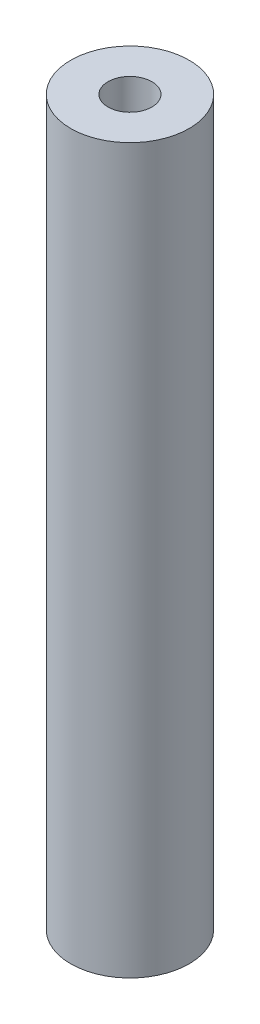
ISO-10303-21;
HEADER;
FILE_DESCRIPTION(('STEP AP214'),'2;1');
FILE_NAME('part.step','',(''),(''),'','','');
FILE_SCHEMA(('AUTOMOTIVE_DESIGN { 1 0 10303 214 1 1 1 1 }'));
ENDSEC;
DATA;
#1=APPLICATION_CONTEXT('core data for automotive mechanical design processes');
#2=APPLICATION_PROTOCOL_DEFINITION('international standard','automotive_design',2000,#1);
#3=PRODUCT_CONTEXT('',#1,'mechanical');
#4=PRODUCT('Part','Part','',(#3));
#5=PRODUCT_RELATED_PRODUCT_CATEGORY('part','',(#4));
#6=PRODUCT_DEFINITION_FORMATION('','',#4);
#7=PRODUCT_DEFINITION_CONTEXT('part definition',#1,'design');
#8=PRODUCT_DEFINITION('design','',#6,#7);
#9=PRODUCT_DEFINITION_SHAPE('','',#8);
#10=(LENGTH_UNIT() NAMED_UNIT(*) SI_UNIT(.MILLI.,.METRE.));
#11=(NAMED_UNIT(*) PLANE_ANGLE_UNIT() SI_UNIT($,.RADIAN.));
#12=(NAMED_UNIT(*) SI_UNIT($,.STERADIAN.) SOLID_ANGLE_UNIT());
#13=UNCERTAINTY_MEASURE_WITH_UNIT(LENGTH_MEASURE(1.E-05),#10,'distance_accuracy_value','');
#14=(GEOMETRIC_REPRESENTATION_CONTEXT(3) GLOBAL_UNCERTAINTY_ASSIGNED_CONTEXT((#13)) GLOBAL_UNIT_ASSIGNED_CONTEXT((#10,
#11,#12)) REPRESENTATION_CONTEXT('',''));
#15=CARTESIAN_POINT('',(0.,0.,0.));
#16=DIRECTION('',(0.,0.,1.));
#17=DIRECTION('',(1.,0.,0.));
#18=AXIS2_PLACEMENT_3D('',#15,#16,#17);
#19=CARTESIAN_POINT('',(0.,69.8246,0.));
#20=DIRECTION('',(0.,1.,0.));
#21=DIRECTION('',(0.,0.,1.));
#22=AXIS2_PLACEMENT_3D('',#19,#20,#21);
#23=PLANE('',#22);
#24=CARTESIAN_POINT('',(0.,69.8246,0.));
#25=DIRECTION('',(0.,1.,0.));
#26=DIRECTION('',(0.,0.,1.));
#27=AXIS2_PLACEMENT_3D('',#24,#25,#26);
#28=CIRCLE('',#27,5.715);
#29=CARTESIAN_POINT('',(0.,69.8246,5.715));
#30=VERTEX_POINT('',#29);
#31=EDGE_CURVE('E10',#30,#30,#28,.T.);
#32=ORIENTED_EDGE('',*,*,#31,.T.);
#33=EDGE_LOOP('',(#32));
#34=FACE_BOUND('',#33,.T.);
#35=CARTESIAN_POINT('',(0.,69.8246,0.));
#36=DIRECTION('',(0.,1.,0.));
#37=DIRECTION('',(0.,0.,1.));
#38=AXIS2_PLACEMENT_3D('',#35,#36,#37);
#39=CIRCLE('',#38,2.1209);
#40=CARTESIAN_POINT('',(0.,69.8246,2.1209));
#41=VERTEX_POINT('',#40);
#42=EDGE_CURVE('E42',#41,#41,#39,.T.);
#43=ORIENTED_EDGE('',*,*,#42,.F.);
#44=EDGE_LOOP('',(#43));
#45=FACE_BOUND('',#44,.T.);
#46=ADVANCED_FACE('F31',(#34,#45),#23,.T.);
#47=CARTESIAN_POINT('',(0.,0.,0.));
#48=DIRECTION('',(0.,1.,0.));
#49=DIRECTION('',(0.,0.,1.));
#50=AXIS2_PLACEMENT_3D('',#47,#48,#49);
#51=PLANE('',#50);
#52=CARTESIAN_POINT('',(0.,0.,0.));
#53=DIRECTION('',(0.,1.,0.));
#54=DIRECTION('',(0.,0.,1.));
#55=AXIS2_PLACEMENT_3D('',#52,#53,#54);
#56=CIRCLE('',#55,5.715);
#57=CARTESIAN_POINT('',(0.,0.,5.715));
#58=VERTEX_POINT('',#57);
#59=EDGE_CURVE('E35',#58,#58,#56,.T.);
#60=ORIENTED_EDGE('',*,*,#59,.F.);
#61=EDGE_LOOP('',(#60));
#62=FACE_BOUND('',#61,.T.);
#63=CARTESIAN_POINT('',(0.,0.,0.));
#64=DIRECTION('',(0.,1.,0.));
#65=DIRECTION('',(0.,0.,1.));
#66=AXIS2_PLACEMENT_3D('',#63,#64,#65);
#67=CIRCLE('',#66,2.1209);
#68=CARTESIAN_POINT('',(0.,0.,2.1209));
#69=VERTEX_POINT('',#68);
#70=EDGE_CURVE('E44',#69,#69,#67,.T.);
#71=ORIENTED_EDGE('',*,*,#70,.T.);
#72=EDGE_LOOP('',(#71));
#73=FACE_BOUND('',#72,.T.);
#74=ADVANCED_FACE('F54',(#62,#73),#51,.F.);
#75=CARTESIAN_POINT('',(0.,69.8246,0.));
#76=DIRECTION('',(0.,-1.,0.));
#77=DIRECTION('',(0.,0.,-1.));
#78=AXIS2_PLACEMENT_3D('',#75,#76,#77);
#79=CYLINDRICAL_SURFACE('',#78,5.715);
#80=ORIENTED_EDGE('',*,*,#31,.F.);
#81=EDGE_LOOP('',(#80));
#82=FACE_BOUND('',#81,.T.);
#83=ORIENTED_EDGE('',*,*,#59,.T.);
#84=EDGE_LOOP('',(#83));
#85=FACE_BOUND('',#84,.T.);
#86=ADVANCED_FACE('F33',(#82,#85),#79,.T.);
#87=CARTESIAN_POINT('',(0.,69.8246,0.));
#88=DIRECTION('',(0.,-1.,0.));
#89=DIRECTION('',(0.,0.,-1.));
#90=AXIS2_PLACEMENT_3D('',#87,#88,#89);
#91=CYLINDRICAL_SURFACE('',#90,2.1209);
#92=ORIENTED_EDGE('',*,*,#42,.T.);
#93=EDGE_LOOP('',(#92));
#94=FACE_BOUND('',#93,.T.);
#95=ORIENTED_EDGE('',*,*,#70,.F.);
#96=EDGE_LOOP('',(#95));
#97=FACE_BOUND('',#96,.T.);
#98=ADVANCED_FACE('F50',(#94,#97),#91,.F.);
#99=CLOSED_SHELL('',(#46,#74,#86,#98));
#100=MANIFOLD_SOLID_BREP('B2',#99);
#101=ADVANCED_BREP_SHAPE_REPRESENTATION('',(#18,#100),#14);
#102=SHAPE_DEFINITION_REPRESENTATION(#9,#101);
ENDSEC;
END-ISO-10303-21;
